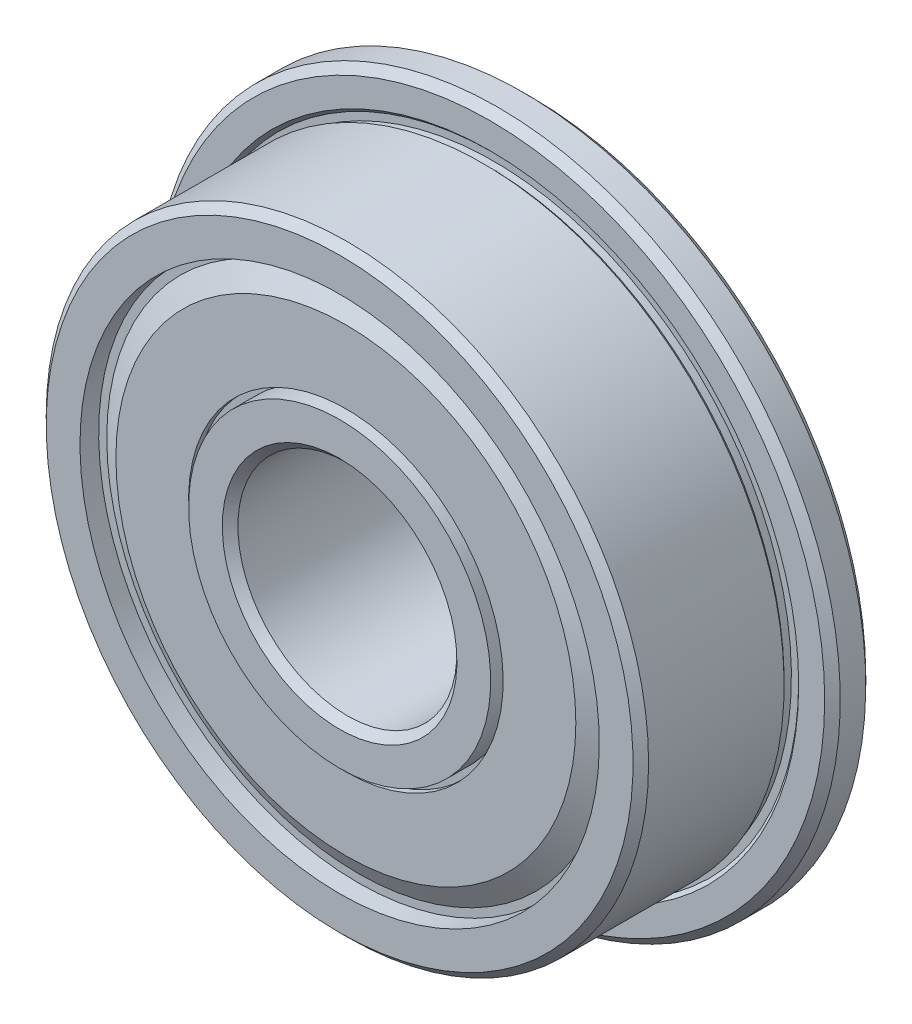
ISO-10303-21;
HEADER;
FILE_DESCRIPTION(('STEP AP214'),'2;1');
FILE_NAME('part.step','',(''),(''),'','','');
FILE_SCHEMA(('AUTOMOTIVE_DESIGN { 1 0 10303 214 1 1 1 1 }'));
ENDSEC;
DATA;
#1=APPLICATION_CONTEXT('core data for automotive mechanical design processes');
#2=APPLICATION_PROTOCOL_DEFINITION('international standard','automotive_design',2000,#1);
#3=PRODUCT_CONTEXT('',#1,'mechanical');
#4=PRODUCT('Part','Part','',(#3));
#5=PRODUCT_RELATED_PRODUCT_CATEGORY('part','',(#4));
#6=PRODUCT_DEFINITION_FORMATION('','',#4);
#7=PRODUCT_DEFINITION_CONTEXT('part definition',#1,'design');
#8=PRODUCT_DEFINITION('design','',#6,#7);
#9=PRODUCT_DEFINITION_SHAPE('','',#8);
#10=(LENGTH_UNIT() NAMED_UNIT(*) SI_UNIT(.MILLI.,.METRE.));
#11=(NAMED_UNIT(*) PLANE_ANGLE_UNIT() SI_UNIT($,.RADIAN.));
#12=(NAMED_UNIT(*) SI_UNIT($,.STERADIAN.) SOLID_ANGLE_UNIT());
#13=UNCERTAINTY_MEASURE_WITH_UNIT(LENGTH_MEASURE(1.E-05),#10,'distance_accuracy_value','');
#14=(GEOMETRIC_REPRESENTATION_CONTEXT(3) GLOBAL_UNCERTAINTY_ASSIGNED_CONTEXT((#13)) GLOBAL_UNIT_ASSIGNED_CONTEXT((#10,
#11,#12)) REPRESENTATION_CONTEXT('',''));
#15=CARTESIAN_POINT('',(0.,0.,0.));
#16=DIRECTION('',(0.,0.,1.));
#17=DIRECTION('',(1.,0.,0.));
#18=AXIS2_PLACEMENT_3D('',#15,#16,#17);
#19=CARTESIAN_POINT('',(0.,0.,0.));
#20=DIRECTION('',(0.,0.,1.));
#21=DIRECTION('',(0.,-1.,0.));
#22=AXIS2_PLACEMENT_3D('',#19,#20,#21);
#23=CYLINDRICAL_SURFACE('',#22,9.48333333333333);
#24=CARTESIAN_POINT('',(0.,0.,-2.59));
#25=DIRECTION('',(0.,0.,1.));
#26=DIRECTION('',(0.,-1.,0.));
#27=AXIS2_PLACEMENT_3D('',#24,#25,#26);
#28=CIRCLE('',#27,9.48333333333333);
#29=CARTESIAN_POINT('',(0.,-9.48333333333333,-2.59));
#30=VERTEX_POINT('',#29);
#31=EDGE_CURVE('E80',#30,#30,#28,.T.);
#32=ORIENTED_EDGE('',*,*,#31,.F.);
#33=EDGE_LOOP('',(#32));
#34=FACE_BOUND('',#33,.T.);
#35=CARTESIAN_POINT('',(0.,0.,-2.8175));
#36=DIRECTION('',(0.,0.,1.));
#37=DIRECTION('',(0.,-1.,0.));
#38=AXIS2_PLACEMENT_3D('',#35,#36,#37);
#39=CIRCLE('',#38,9.48333333333333);
#40=CARTESIAN_POINT('',(0.,-9.48333333333333,-2.8175));
#41=VERTEX_POINT('',#40);
#42=EDGE_CURVE('E12',#41,#41,#39,.T.);
#43=ORIENTED_EDGE('',*,*,#42,.T.);
#44=EDGE_LOOP('',(#43));
#45=FACE_BOUND('',#44,.T.);
#46=ADVANCED_FACE('F52',(#34,#45),#23,.T.);
#47=CARTESIAN_POINT('',(0.,9.48333333333333,-2.8175));
#48=DIRECTION('',(0.,0.,1.));
#49=DIRECTION('',(0.,-1.,0.));
#50=AXIS2_PLACEMENT_3D('',#47,#48,#49);
#51=PLANE('',#50);
#52=ORIENTED_EDGE('',*,*,#42,.F.);
#53=EDGE_LOOP('',(#52));
#54=FACE_BOUND('',#53,.T.);
#55=CARTESIAN_POINT('',(0.,0.,-2.8175));
#56=DIRECTION('',(0.,0.,1.));
#57=DIRECTION('',(0.,-1.,0.));
#58=AXIS2_PLACEMENT_3D('',#55,#56,#57);
#59=CIRCLE('',#58,9.18714891746856);
#60=CARTESIAN_POINT('',(0.,-9.18714891746856,-2.8175));
#61=VERTEX_POINT('',#60);
#62=EDGE_CURVE('E58',#61,#61,#59,.T.);
#63=ORIENTED_EDGE('',*,*,#62,.T.);
#64=EDGE_LOOP('',(#63));
#65=FACE_BOUND('',#64,.T.);
#66=ADVANCED_FACE('F87',(#54,#65),#51,.F.);
#67=CARTESIAN_POINT('',(0.,0.,-3.2725));
#68=DIRECTION('',(0.,0.,1.));
#69=DIRECTION('',(0.,-1.,0.));
#70=AXIS2_PLACEMENT_3D('',#67,#68,#69);
#71=CONICAL_SURFACE('',#70,8.39906580002472,1.0471975511966);
#72=ORIENTED_EDGE('',*,*,#62,.F.);
#73=EDGE_LOOP('',(#72));
#74=FACE_BOUND('',#73,.T.);
#75=CARTESIAN_POINT('',(0.,0.,-3.2725));
#76=DIRECTION('',(0.,0.,1.));
#77=DIRECTION('',(0.,-1.,0.));
#78=AXIS2_PLACEMENT_3D('',#75,#76,#77);
#79=CIRCLE('',#78,8.39906580002472);
#80=CARTESIAN_POINT('',(0.,-8.39906580002472,-3.2725));
#81=VERTEX_POINT('',#80);
#82=EDGE_CURVE('E62',#81,#81,#79,.T.);
#83=ORIENTED_EDGE('',*,*,#82,.T.);
#84=EDGE_LOOP('',(#83));
#85=FACE_BOUND('',#84,.T.);
#86=ADVANCED_FACE('F91',(#74,#85),#71,.T.);
#87=CARTESIAN_POINT('',(0.,8.39906580002472,-3.2725));
#88=DIRECTION('',(0.,0.,1.));
#89=DIRECTION('',(0.,-1.,0.));
#90=AXIS2_PLACEMENT_3D('',#87,#88,#89);
#91=PLANE('',#90);
#92=ORIENTED_EDGE('',*,*,#82,.F.);
#93=EDGE_LOOP('',(#92));
#94=FACE_BOUND('',#93,.T.);
#95=CARTESIAN_POINT('',(0.,0.,-3.2725));
#96=DIRECTION('',(0.,0.,1.));
#97=DIRECTION('',(0.,-1.,0.));
#98=AXIS2_PLACEMENT_3D('',#95,#96,#97);
#99=CIRCLE('',#98,5.74416666666667);
#100=CARTESIAN_POINT('',(0.,-5.74416666666667,-3.2725));
#101=VERTEX_POINT('',#100);
#102=EDGE_CURVE('E66',#101,#101,#99,.T.);
#103=ORIENTED_EDGE('',*,*,#102,.T.);
#104=EDGE_LOOP('',(#103));
#105=FACE_BOUND('',#104,.T.);
#106=ADVANCED_FACE('F96',(#94,#105),#91,.F.);
#107=CARTESIAN_POINT('',(0.,0.,0.));
#108=DIRECTION('',(0.,0.,1.));
#109=DIRECTION('',(0.,-1.,0.));
#110=AXIS2_PLACEMENT_3D('',#107,#108,#109);
#111=CYLINDRICAL_SURFACE('',#110,5.74416666666667);
#112=ORIENTED_EDGE('',*,*,#102,.F.);
#113=EDGE_LOOP('',(#112));
#114=FACE_BOUND('',#113,.T.);
#115=CARTESIAN_POINT('',(0.,0.,-3.045));
#116=DIRECTION('',(0.,0.,1.));
#117=DIRECTION('',(0.,-1.,0.));
#118=AXIS2_PLACEMENT_3D('',#115,#116,#117);
#119=CIRCLE('',#118,5.74416666666667);
#120=CARTESIAN_POINT('',(0.,-5.74416666666667,-3.045));
#121=VERTEX_POINT('',#120);
#122=EDGE_CURVE('E71',#121,#121,#119,.T.);
#123=ORIENTED_EDGE('',*,*,#122,.T.);
#124=EDGE_LOOP('',(#123));
#125=FACE_BOUND('',#124,.T.);
#126=ADVANCED_FACE('F102',(#114,#125),#111,.F.);
#127=CARTESIAN_POINT('',(0.,8.33810735874664,-3.045));
#128=DIRECTION('',(0.,0.,-1.));
#129=DIRECTION('',(0.,1.,0.));
#130=AXIS2_PLACEMENT_3D('',#127,#128,#129);
#131=PLANE('',#130);
#132=ORIENTED_EDGE('',*,*,#122,.F.);
#133=EDGE_LOOP('',(#132));
#134=FACE_BOUND('',#133,.T.);
#135=CARTESIAN_POINT('',(0.,0.,-3.045));
#136=DIRECTION('',(0.,0.,1.));
#137=DIRECTION('',(0.,-1.,0.));
#138=AXIS2_PLACEMENT_3D('',#135,#136,#137);
#139=CIRCLE('',#138,8.33810735874664);
#140=CARTESIAN_POINT('',(0.,-8.33810735874664,-3.045));
#141=VERTEX_POINT('',#140);
#142=EDGE_CURVE('E74',#141,#141,#139,.T.);
#143=ORIENTED_EDGE('',*,*,#142,.T.);
#144=EDGE_LOOP('',(#143));
#145=FACE_BOUND('',#144,.T.);
#146=ADVANCED_FACE('F106',(#134,#145),#131,.F.);
#147=CARTESIAN_POINT('',(0.,0.,-2.59));
#148=DIRECTION('',(0.,0.,1.));
#149=DIRECTION('',(0.,-1.,0.));
#150=AXIS2_PLACEMENT_3D('',#147,#148,#149);
#151=CONICAL_SURFACE('',#150,9.12619047619048,1.0471975511966);
#152=ORIENTED_EDGE('',*,*,#142,.F.);
#153=EDGE_LOOP('',(#152));
#154=FACE_BOUND('',#153,.T.);
#155=CARTESIAN_POINT('',(0.,0.,-2.59));
#156=DIRECTION('',(0.,0.,1.));
#157=DIRECTION('',(0.,-1.,0.));
#158=AXIS2_PLACEMENT_3D('',#155,#156,#157);
#159=CIRCLE('',#158,9.12619047619048);
#160=CARTESIAN_POINT('',(0.,-9.12619047619048,-2.59));
#161=VERTEX_POINT('',#160);
#162=EDGE_CURVE('E77',#161,#161,#159,.T.);
#163=ORIENTED_EDGE('',*,*,#162,.T.);
#164=EDGE_LOOP('',(#163));
#165=FACE_BOUND('',#164,.T.);
#166=ADVANCED_FACE('F110',(#154,#165),#151,.F.);
#167=CARTESIAN_POINT('',(0.,9.48333333333333,-2.59));
#168=DIRECTION('',(0.,0.,-1.));
#169=DIRECTION('',(0.,1.,0.));
#170=AXIS2_PLACEMENT_3D('',#167,#168,#169);
#171=PLANE('',#170);
#172=ORIENTED_EDGE('',*,*,#162,.F.);
#173=EDGE_LOOP('',(#172));
#174=FACE_BOUND('',#173,.T.);
#175=ORIENTED_EDGE('',*,*,#31,.T.);
#176=EDGE_LOOP('',(#175));
#177=FACE_BOUND('',#176,.T.);
#178=ADVANCED_FACE('F84',(#174,#177),#171,.F.);
#179=CLOSED_SHELL('',(#46,#66,#86,#106,#126,#146,#166,#178));
#180=MANIFOLD_SOLID_BREP('B2',#179);
#181=CARTESIAN_POINT('',(0.,0.,0.));
#182=DIRECTION('',(0.,0.,1.));
#183=DIRECTION('',(0.,-1.,0.));
#184=AXIS2_PLACEMENT_3D('',#181,#182,#183);
#185=CYLINDRICAL_SURFACE('',#184,9.48333333333333);
#186=CARTESIAN_POINT('',(0.,0.,2.8175));
#187=DIRECTION('',(0.,0.,1.));
#188=DIRECTION('',(0.,-1.,0.));
#189=AXIS2_PLACEMENT_3D('',#186,#187,#188);
#190=CIRCLE('',#189,9.48333333333333);
#191=CARTESIAN_POINT('',(0.,-9.48333333333333,2.8175));
#192=VERTEX_POINT('',#191);
#193=EDGE_CURVE('E51',#192,#192,#190,.T.);
#194=ORIENTED_EDGE('',*,*,#193,.F.);
#195=EDGE_LOOP('',(#194));
#196=FACE_BOUND('',#195,.T.);
#197=CARTESIAN_POINT('',(0.,0.,2.59));
#198=DIRECTION('',(0.,0.,1.));
#199=DIRECTION('',(0.,-1.,0.));
#200=AXIS2_PLACEMENT_3D('',#197,#198,#199);
#201=CIRCLE('',#200,9.48333333333333);
#202=CARTESIAN_POINT('',(0.,-9.48333333333333,2.59));
#203=VERTEX_POINT('',#202);
#204=EDGE_CURVE('E192',#203,#203,#201,.T.);
#205=ORIENTED_EDGE('',*,*,#204,.T.);
#206=EDGE_LOOP('',(#205));
#207=FACE_BOUND('',#206,.T.);
#208=ADVANCED_FACE('F164',(#196,#207),#185,.T.);
#209=CARTESIAN_POINT('',(0.,9.48333333333333,2.8175));
#210=DIRECTION('',(0.,0.,-1.));
#211=DIRECTION('',(0.,1.,0.));
#212=AXIS2_PLACEMENT_3D('',#209,#210,#211);
#213=PLANE('',#212);
#214=CARTESIAN_POINT('',(0.,0.,2.8175));
#215=DIRECTION('',(0.,0.,1.));
#216=DIRECTION('',(0.,-1.,0.));
#217=AXIS2_PLACEMENT_3D('',#214,#215,#216);
#218=CIRCLE('',#217,9.18714891746856);
#219=CARTESIAN_POINT('',(0.,-9.18714891746856,2.8175));
#220=VERTEX_POINT('',#219);
#221=EDGE_CURVE('E170',#220,#220,#218,.T.);
#222=ORIENTED_EDGE('',*,*,#221,.F.);
#223=EDGE_LOOP('',(#222));
#224=FACE_BOUND('',#223,.T.);
#225=ORIENTED_EDGE('',*,*,#193,.T.);
#226=EDGE_LOOP('',(#225));
#227=FACE_BOUND('',#226,.T.);
#228=ADVANCED_FACE('F229',(#224,#227),#213,.F.);
#229=CARTESIAN_POINT('',(0.,0.,2.8175));
#230=DIRECTION('',(0.,0.,-1.));
#231=DIRECTION('',(0.,1.,0.));
#232=AXIS2_PLACEMENT_3D('',#229,#230,#231);
#233=CONICAL_SURFACE('',#232,9.18714891746856,1.0471975511966);
#234=CARTESIAN_POINT('',(0.,0.,3.2725));
#235=DIRECTION('',(0.,0.,1.));
#236=DIRECTION('',(0.,-1.,0.));
#237=AXIS2_PLACEMENT_3D('',#234,#235,#236);
#238=CIRCLE('',#237,8.39906580002472);
#239=CARTESIAN_POINT('',(0.,-8.39906580002472,3.2725));
#240=VERTEX_POINT('',#239);
#241=EDGE_CURVE('E174',#240,#240,#238,.T.);
#242=ORIENTED_EDGE('',*,*,#241,.F.);
#243=EDGE_LOOP('',(#242));
#244=FACE_BOUND('',#243,.T.);
#245=ORIENTED_EDGE('',*,*,#221,.T.);
#246=EDGE_LOOP('',(#245));
#247=FACE_BOUND('',#246,.T.);
#248=ADVANCED_FACE('F224',(#244,#247),#233,.T.);
#249=CARTESIAN_POINT('',(0.,8.39906580002472,3.2725));
#250=DIRECTION('',(0.,0.,-1.));
#251=DIRECTION('',(0.,1.,0.));
#252=AXIS2_PLACEMENT_3D('',#249,#250,#251);
#253=PLANE('',#252);
#254=CARTESIAN_POINT('',(0.,0.,3.2725));
#255=DIRECTION('',(0.,0.,1.));
#256=DIRECTION('',(0.,-1.,0.));
#257=AXIS2_PLACEMENT_3D('',#254,#255,#256);
#258=CIRCLE('',#257,5.74416666666666);
#259=CARTESIAN_POINT('',(0.,-5.74416666666666,3.2725));
#260=VERTEX_POINT('',#259);
#261=EDGE_CURVE('E178',#260,#260,#258,.T.);
#262=ORIENTED_EDGE('',*,*,#261,.F.);
#263=EDGE_LOOP('',(#262));
#264=FACE_BOUND('',#263,.T.);
#265=ORIENTED_EDGE('',*,*,#241,.T.);
#266=EDGE_LOOP('',(#265));
#267=FACE_BOUND('',#266,.T.);
#268=ADVANCED_FACE('F218',(#264,#267),#253,.F.);
#269=CARTESIAN_POINT('',(0.,0.,0.));
#270=DIRECTION('',(0.,0.,1.));
#271=DIRECTION('',(0.,-1.,0.));
#272=AXIS2_PLACEMENT_3D('',#269,#270,#271);
#273=CYLINDRICAL_SURFACE('',#272,5.74416666666666);
#274=CARTESIAN_POINT('',(0.,0.,3.045));
#275=DIRECTION('',(0.,0.,1.));
#276=DIRECTION('',(0.,-1.,0.));
#277=AXIS2_PLACEMENT_3D('',#274,#275,#276);
#278=CIRCLE('',#277,5.74416666666666);
#279=CARTESIAN_POINT('',(0.,-5.74416666666666,3.045));
#280=VERTEX_POINT('',#279);
#281=EDGE_CURVE('E183',#280,#280,#278,.T.);
#282=ORIENTED_EDGE('',*,*,#281,.F.);
#283=EDGE_LOOP('',(#282));
#284=FACE_BOUND('',#283,.T.);
#285=ORIENTED_EDGE('',*,*,#261,.T.);
#286=EDGE_LOOP('',(#285));
#287=FACE_BOUND('',#286,.T.);
#288=ADVANCED_FACE('F212',(#284,#287),#273,.F.);
#289=CARTESIAN_POINT('',(0.,8.33810735874663,3.045));
#290=DIRECTION('',(0.,0.,1.));
#291=DIRECTION('',(0.,-1.,0.));
#292=AXIS2_PLACEMENT_3D('',#289,#290,#291);
#293=PLANE('',#292);
#294=CARTESIAN_POINT('',(0.,0.,3.045));
#295=DIRECTION('',(0.,0.,1.));
#296=DIRECTION('',(0.,-1.,0.));
#297=AXIS2_PLACEMENT_3D('',#294,#295,#296);
#298=CIRCLE('',#297,8.33810735874663);
#299=CARTESIAN_POINT('',(0.,-8.33810735874663,3.045));
#300=VERTEX_POINT('',#299);
#301=EDGE_CURVE('E186',#300,#300,#298,.T.);
#302=ORIENTED_EDGE('',*,*,#301,.F.);
#303=EDGE_LOOP('',(#302));
#304=FACE_BOUND('',#303,.T.);
#305=ORIENTED_EDGE('',*,*,#281,.T.);
#306=EDGE_LOOP('',(#305));
#307=FACE_BOUND('',#306,.T.);
#308=ADVANCED_FACE('F206',(#304,#307),#293,.F.);
#309=CARTESIAN_POINT('',(0.,0.,3.045));
#310=DIRECTION('',(0.,0.,-1.));
#311=DIRECTION('',(0.,1.,0.));
#312=AXIS2_PLACEMENT_3D('',#309,#310,#311);
#313=CONICAL_SURFACE('',#312,8.33810735874663,1.0471975511966);
#314=CARTESIAN_POINT('',(0.,0.,2.59));
#315=DIRECTION('',(0.,0.,1.));
#316=DIRECTION('',(0.,-1.,0.));
#317=AXIS2_PLACEMENT_3D('',#314,#315,#316);
#318=CIRCLE('',#317,9.12619047619048);
#319=CARTESIAN_POINT('',(0.,-9.12619047619048,2.59));
#320=VERTEX_POINT('',#319);
#321=EDGE_CURVE('E189',#320,#320,#318,.T.);
#322=ORIENTED_EDGE('',*,*,#321,.F.);
#323=EDGE_LOOP('',(#322));
#324=FACE_BOUND('',#323,.T.);
#325=ORIENTED_EDGE('',*,*,#301,.T.);
#326=EDGE_LOOP('',(#325));
#327=FACE_BOUND('',#326,.T.);
#328=ADVANCED_FACE('F200',(#324,#327),#313,.F.);
#329=CARTESIAN_POINT('',(0.,9.48333333333333,2.59));
#330=DIRECTION('',(0.,0.,1.));
#331=DIRECTION('',(0.,-1.,0.));
#332=AXIS2_PLACEMENT_3D('',#329,#330,#331);
#333=PLANE('',#332);
#334=ORIENTED_EDGE('',*,*,#204,.F.);
#335=EDGE_LOOP('',(#334));
#336=FACE_BOUND('',#335,.T.);
#337=ORIENTED_EDGE('',*,*,#321,.T.);
#338=EDGE_LOOP('',(#337));
#339=FACE_BOUND('',#338,.T.);
#340=ADVANCED_FACE('F197',(#336,#339),#333,.F.);
#341=CLOSED_SHELL('',(#208,#228,#248,#268,#288,#308,#328,#340));
#342=MANIFOLD_SOLID_BREP('B7',#341);
#343=CARTESIAN_POINT('',(-5.30330085889904,5.30330085889917,0.));
#344=DIRECTION('',(-0.707106781186539,0.707106781186556,0.));
#345=DIRECTION('',(0.707106781186556,0.707106781186539,0.));
#346=AXIS2_PLACEMENT_3D('',#343,#344,#345);
#347=SPHERICAL_SURFACE('',#346,1.9845);
#348=CARTESIAN_POINT('',(-6.70655426616373,6.70655426616389,0.));
#349=VERTEX_POINT('',#348);
#350=VERTEX_LOOP('',#349);
#351=FACE_BOUND('',#350,.T.);
#352=ADVANCED_FACE('F276',(#351),#347,.T.);
#353=CLOSED_SHELL('',(#352));
#354=MANIFOLD_SOLID_BREP('B46',#353);
#355=CARTESIAN_POINT('',(-7.5,0.,0.));
#356=DIRECTION('',(-1.,0.,0.));
#357=DIRECTION('',(0.,1.,0.));
#358=AXIS2_PLACEMENT_3D('',#355,#356,#357);
#359=SPHERICAL_SURFACE('',#358,1.9845);
#360=CARTESIAN_POINT('',(-9.4845,0.,0.));
#361=VERTEX_POINT('',#360);
#362=VERTEX_LOOP('',#361);
#363=FACE_BOUND('',#362,.T.);
#364=ADVANCED_FACE('F293',(#363),#359,.T.);
#365=CLOSED_SHELL('',(#364));
#366=MANIFOLD_SOLID_BREP('B160',#365);
#367=CARTESIAN_POINT('',(-5.30330085889915,-5.30330085889906,0.));
#368=DIRECTION('',(-0.707106781186554,-0.707106781186541,0.));
#369=DIRECTION('',(-0.707106781186541,0.707106781186554,0.));
#370=AXIS2_PLACEMENT_3D('',#367,#368,#369);
#371=SPHERICAL_SURFACE('',#370,1.9845);
#372=CARTESIAN_POINT('',(-6.70655426616387,-6.70655426616375,0.));
#373=VERTEX_POINT('',#372);
#374=VERTEX_LOOP('',#373);
#375=FACE_BOUND('',#374,.T.);
#376=ADVANCED_FACE('F310',(#375),#371,.T.);
#377=CLOSED_SHELL('',(#376));
#378=MANIFOLD_SOLID_BREP('B272',#377);
#379=CARTESIAN_POINT('',(0.,-7.5,0.));
#380=DIRECTION('',(0.,-1.,0.));
#381=DIRECTION('',(-1.,0.,0.));
#382=AXIS2_PLACEMENT_3D('',#379,#380,#381);
#383=SPHERICAL_SURFACE('',#382,1.9845);
#384=CARTESIAN_POINT('',(0.,-9.4845,0.));
#385=VERTEX_POINT('',#384);
#386=VERTEX_LOOP('',#385);
#387=FACE_BOUND('',#386,.T.);
#388=ADVANCED_FACE('F327',(#387),#383,.T.);
#389=CLOSED_SHELL('',(#388));
#390=MANIFOLD_SOLID_BREP('B289',#389);
#391=CARTESIAN_POINT('',(5.30330085889908,-5.30330085889913,0.));
#392=DIRECTION('',(0.707106781186544,-0.707106781186551,0.));
#393=DIRECTION('',(-0.707106781186551,-0.707106781186544,0.));
#394=AXIS2_PLACEMENT_3D('',#391,#392,#393);
#395=SPHERICAL_SURFACE('',#394,1.9845);
#396=CARTESIAN_POINT('',(6.70655426616378,-6.70655426616384,0.));
#397=VERTEX_POINT('',#396);
#398=VERTEX_LOOP('',#397);
#399=FACE_BOUND('',#398,.T.);
#400=ADVANCED_FACE('F344',(#399),#395,.T.);
#401=CLOSED_SHELL('',(#400));
#402=MANIFOLD_SOLID_BREP('B306',#401);
#403=CARTESIAN_POINT('',(7.5,0.,0.));
#404=DIRECTION('',(1.,0.,0.));
#405=DIRECTION('',(0.,-1.,0.));
#406=AXIS2_PLACEMENT_3D('',#403,#404,#405);
#407=SPHERICAL_SURFACE('',#406,1.9845);
#408=CARTESIAN_POINT('',(9.4845,0.,0.));
#409=VERTEX_POINT('',#408);
#410=VERTEX_LOOP('',#409);
#411=FACE_BOUND('',#410,.T.);
#412=ADVANCED_FACE('F361',(#411),#407,.T.);
#413=CLOSED_SHELL('',(#412));
#414=MANIFOLD_SOLID_BREP('B323',#413);
#415=CARTESIAN_POINT('',(5.30330085889912,5.3033008588991,0.));
#416=DIRECTION('',(0.707106781186549,0.707106781186546,0.));
#417=DIRECTION('',(0.707106781186546,-0.707106781186549,0.));
#418=AXIS2_PLACEMENT_3D('',#415,#416,#417);
#419=SPHERICAL_SURFACE('',#418,1.9845);
#420=CARTESIAN_POINT('',(6.70655426616382,6.7065542661638,0.));
#421=VERTEX_POINT('',#420);
#422=VERTEX_LOOP('',#421);
#423=FACE_BOUND('',#422,.T.);
#424=ADVANCED_FACE('F378',(#423),#419,.T.);
#425=CLOSED_SHELL('',(#424));
#426=MANIFOLD_SOLID_BREP('B340',#425);
#427=CARTESIAN_POINT('',(0.,7.5,0.));
#428=DIRECTION('',(0.,1.,0.));
#429=DIRECTION('',(1.,0.,0.));
#430=AXIS2_PLACEMENT_3D('',#427,#428,#429);
#431=SPHERICAL_SURFACE('',#430,1.9845);
#432=CARTESIAN_POINT('',(0.,9.4845,0.));
#433=VERTEX_POINT('',#432);
#434=VERTEX_LOOP('',#433);
#435=FACE_BOUND('',#434,.T.);
#436=ADVANCED_FACE('F398',(#435),#431,.T.);
#437=CLOSED_SHELL('',(#436));
#438=MANIFOLD_SOLID_BREP('B357',#437);
#439=CARTESIAN_POINT('',(0.,0.,0.));
#440=DIRECTION('',(0.,0.,1.));
#441=DIRECTION('',(0.,-1.,0.));
#442=AXIS2_PLACEMENT_3D('',#439,#440,#441);
#443=CYLINDRICAL_SURFACE('',#442,6.275);
#444=CARTESIAN_POINT('',(0.,0.,1.56128640870277));
#445=DIRECTION('',(0.,0.,1.));
#446=DIRECTION('',(0.,-1.,0.));
#447=AXIS2_PLACEMENT_3D('',#444,#445,#446);
#448=CIRCLE('',#447,6.275);
#449=CARTESIAN_POINT('',(0.,-6.275,1.56128640870277));
#450=VERTEX_POINT('',#449);
#451=EDGE_CURVE('E441',#450,#450,#448,.T.);
#452=ORIENTED_EDGE('',*,*,#451,.T.);
#453=EDGE_LOOP('',(#452));
#454=FACE_BOUND('',#453,.T.);
#455=CARTESIAN_POINT('',(0.,0.,2.59));
#456=DIRECTION('',(0.,0.,1.));
#457=DIRECTION('',(0.,-1.,0.));
#458=AXIS2_PLACEMENT_3D('',#455,#456,#457);
#459=CIRCLE('',#458,6.275);
#460=CARTESIAN_POINT('',(0.,-6.275,2.59));
#461=VERTEX_POINT('',#460);
#462=EDGE_CURVE('E459',#461,#461,#459,.T.);
#463=ORIENTED_EDGE('',*,*,#462,.F.);
#464=EDGE_LOOP('',(#463));
#465=FACE_BOUND('',#464,.T.);
#466=ADVANCED_FACE('F418',(#454,#465),#443,.T.);
#467=CARTESIAN_POINT('',(0.,4.,3.5));
#468=DIRECTION('',(0.,0.,-1.));
#469=DIRECTION('',(0.,1.,0.));
#470=AXIS2_PLACEMENT_3D('',#467,#468,#469);
#471=PLANE('',#470);
#472=CARTESIAN_POINT('',(0.,0.,3.5));
#473=DIRECTION('',(0.,0.,-1.));
#474=DIRECTION('',(0.,1.,0.));
#475=AXIS2_PLACEMENT_3D('',#472,#473,#474);
#476=CIRCLE('',#475,4.284375);
#477=CARTESIAN_POINT('',(0.,4.284375,3.5));
#478=VERTEX_POINT('',#477);
#479=EDGE_CURVE('E397',#478,#478,#476,.T.);
#480=ORIENTED_EDGE('',*,*,#479,.T.);
#481=EDGE_LOOP('',(#480));
#482=FACE_BOUND('',#481,.T.);
#483=CARTESIAN_POINT('',(0.,0.,3.5));
#484=DIRECTION('',(0.,0.,1.));
#485=DIRECTION('',(0.,-1.,0.));
#486=AXIS2_PLACEMENT_3D('',#483,#484,#485);
#487=CIRCLE('',#486,5.51666666666667);
#488=CARTESIAN_POINT('',(0.,-5.51666666666667,3.5));
#489=VERTEX_POINT('',#488);
#490=EDGE_CURVE('E453',#489,#489,#487,.T.);
#491=ORIENTED_EDGE('',*,*,#490,.T.);
#492=EDGE_LOOP('',(#491));
#493=FACE_BOUND('',#492,.T.);
#494=ADVANCED_FACE('F467',(#482,#493),#471,.F.);
#495=CARTESIAN_POINT('',(0.,0.,0.));
#496=DIRECTION('',(0.,0.,1.));
#497=DIRECTION('',(0.,-1.,0.));
#498=AXIS2_PLACEMENT_3D('',#495,#496,#497);
#499=CYLINDRICAL_SURFACE('',#498,6.275);
#500=CARTESIAN_POINT('',(0.,0.,-1.56128640870277));
#501=DIRECTION('',(0.,0.,1.));
#502=DIRECTION('',(0.,-1.,0.));
#503=AXIS2_PLACEMENT_3D('',#500,#501,#502);
#504=CIRCLE('',#503,6.275);
#505=CARTESIAN_POINT('',(0.,-6.275,-1.56128640870277));
#506=VERTEX_POINT('',#505);
#507=EDGE_CURVE('E438',#506,#506,#504,.T.);
#508=ORIENTED_EDGE('',*,*,#507,.F.);
#509=EDGE_LOOP('',(#508));
#510=FACE_BOUND('',#509,.T.);
#511=CARTESIAN_POINT('',(0.,0.,-2.59));
#512=DIRECTION('',(0.,0.,1.));
#513=DIRECTION('',(0.,-1.,0.));
#514=AXIS2_PLACEMENT_3D('',#511,#512,#513);
#515=CIRCLE('',#514,6.275);
#516=CARTESIAN_POINT('',(0.,-6.275,-2.59));
#517=VERTEX_POINT('',#516);
#518=EDGE_CURVE('E450',#517,#517,#515,.T.);
#519=ORIENTED_EDGE('',*,*,#518,.T.);
#520=EDGE_LOOP('',(#519));
#521=FACE_BOUND('',#520,.T.);
#522=ADVANCED_FACE('F474',(#510,#521),#499,.T.);
#523=CARTESIAN_POINT('',(0.,6.275,-3.5));
#524=DIRECTION('',(0.,0.,1.));
#525=DIRECTION('',(0.,-1.,0.));
#526=AXIS2_PLACEMENT_3D('',#523,#524,#525);
#527=PLANE('',#526);
#528=CARTESIAN_POINT('',(0.,0.,-3.5));
#529=DIRECTION('',(0.,0.,1.));
#530=DIRECTION('',(0.,-1.,0.));
#531=AXIS2_PLACEMENT_3D('',#528,#529,#530);
#532=CIRCLE('',#531,4.284375);
#533=CARTESIAN_POINT('',(0.,-4.284375,-3.5));
#534=VERTEX_POINT('',#533);
#535=EDGE_CURVE('E433',#534,#534,#532,.T.);
#536=ORIENTED_EDGE('',*,*,#535,.T.);
#537=EDGE_LOOP('',(#536));
#538=FACE_BOUND('',#537,.T.);
#539=CARTESIAN_POINT('',(0.,0.,-3.5));
#540=DIRECTION('',(0.,0.,1.));
#541=DIRECTION('',(0.,-1.,0.));
#542=AXIS2_PLACEMENT_3D('',#539,#540,#541);
#543=CIRCLE('',#542,5.51666666666667);
#544=CARTESIAN_POINT('',(0.,-5.51666666666667,-3.5));
#545=VERTEX_POINT('',#544);
#546=EDGE_CURVE('E444',#545,#545,#543,.T.);
#547=ORIENTED_EDGE('',*,*,#546,.F.);
#548=EDGE_LOOP('',(#547));
#549=FACE_BOUND('',#548,.T.);
#550=ADVANCED_FACE('F482',(#538,#549),#527,.F.);
#551=CARTESIAN_POINT('',(0.,0.,0.));
#552=DIRECTION('',(0.,0.,1.));
#553=DIRECTION('',(0.,-1.,0.));
#554=AXIS2_PLACEMENT_3D('',#551,#552,#553);
#555=TOROIDAL_SURFACE('',#554,7.5,1.9845);
#556=ORIENTED_EDGE('',*,*,#451,.F.);
#557=EDGE_LOOP('',(#556));
#558=FACE_BOUND('',#557,.T.);
#559=ORIENTED_EDGE('',*,*,#507,.T.);
#560=EDGE_LOOP('',(#559));
#561=FACE_BOUND('',#560,.T.);
#562=ADVANCED_FACE('F478',(#558,#561),#555,.F.);
#563=CARTESIAN_POINT('',(0.,0.,0.));
#564=DIRECTION('',(0.,0.,1.));
#565=DIRECTION('',(0.,-1.,0.));
#566=AXIS2_PLACEMENT_3D('',#563,#564,#565);
#567=CYLINDRICAL_SURFACE('',#566,4.);
#568=CARTESIAN_POINT('',(0.,0.,-3.215625));
#569=DIRECTION('',(0.,0.,1.));
#570=DIRECTION('',(0.,-1.,0.));
#571=AXIS2_PLACEMENT_3D('',#568,#569,#570);
#572=CIRCLE('',#571,4.);
#573=CARTESIAN_POINT('',(0.,-4.,-3.215625));
#574=VERTEX_POINT('',#573);
#575=EDGE_CURVE('E425',#574,#574,#572,.F.);
#576=ORIENTED_EDGE('',*,*,#575,.T.);
#577=EDGE_LOOP('',(#576));
#578=FACE_BOUND('',#577,.T.);
#579=CARTESIAN_POINT('',(0.,0.,3.215625));
#580=DIRECTION('',(0.,0.,-1.));
#581=DIRECTION('',(0.,1.,0.));
#582=AXIS2_PLACEMENT_3D('',#579,#580,#581);
#583=CIRCLE('',#582,4.);
#584=CARTESIAN_POINT('',(0.,4.,3.215625));
#585=VERTEX_POINT('',#584);
#586=EDGE_CURVE('E429',#585,#585,#583,.F.);
#587=ORIENTED_EDGE('',*,*,#586,.T.);
#588=EDGE_LOOP('',(#587));
#589=FACE_BOUND('',#588,.T.);
#590=ADVANCED_FACE('F481',(#578,#589),#567,.F.);
#591=CARTESIAN_POINT('',(0.,0.,-3.5));
#592=DIRECTION('',(0.,0.,-1.));
#593=DIRECTION('',(0.,1.,0.));
#594=AXIS2_PLACEMENT_3D('',#591,#592,#593);
#595=CONICAL_SURFACE('',#594,4.284375,0.785398163397448);
#596=ORIENTED_EDGE('',*,*,#575,.F.);
#597=EDGE_LOOP('',(#596));
#598=FACE_BOUND('',#597,.T.);
#599=ORIENTED_EDGE('',*,*,#535,.F.);
#600=EDGE_LOOP('',(#599));
#601=FACE_BOUND('',#600,.T.);
#602=ADVANCED_FACE('F486',(#598,#601),#595,.F.);
#603=CARTESIAN_POINT('',(0.,0.,3.215625));
#604=DIRECTION('',(0.,0.,1.));
#605=DIRECTION('',(0.,-1.,0.));
#606=AXIS2_PLACEMENT_3D('',#603,#604,#605);
#607=CONICAL_SURFACE('',#606,4.,0.785398163397448);
#608=ORIENTED_EDGE('',*,*,#479,.F.);
#609=EDGE_LOOP('',(#608));
#610=FACE_BOUND('',#609,.T.);
#611=ORIENTED_EDGE('',*,*,#586,.F.);
#612=EDGE_LOOP('',(#611));
#613=FACE_BOUND('',#612,.T.);
#614=ADVANCED_FACE('F420',(#610,#613),#607,.F.);
#615=CARTESIAN_POINT('',(0.,0.,0.));
#616=DIRECTION('',(0.,0.,1.));
#617=DIRECTION('',(0.,-1.,0.));
#618=AXIS2_PLACEMENT_3D('',#615,#616,#617);
#619=CYLINDRICAL_SURFACE('',#618,5.51666666666667);
#620=ORIENTED_EDGE('',*,*,#546,.T.);
#621=EDGE_LOOP('',(#620));
#622=FACE_BOUND('',#621,.T.);
#623=CARTESIAN_POINT('',(0.,0.,-2.59));
#624=DIRECTION('',(0.,0.,1.));
#625=DIRECTION('',(0.,-1.,0.));
#626=AXIS2_PLACEMENT_3D('',#623,#624,#625);
#627=CIRCLE('',#626,5.51666666666667);
#628=CARTESIAN_POINT('',(0.,-5.51666666666667,-2.59));
#629=VERTEX_POINT('',#628);
#630=EDGE_CURVE('E447',#629,#629,#627,.T.);
#631=ORIENTED_EDGE('',*,*,#630,.F.);
#632=EDGE_LOOP('',(#631));
#633=FACE_BOUND('',#632,.T.);
#634=ADVANCED_FACE('F492',(#622,#633),#619,.T.);
#635=CARTESIAN_POINT('',(0.,6.275,-2.59));
#636=DIRECTION('',(0.,0.,-1.));
#637=DIRECTION('',(0.,1.,0.));
#638=AXIS2_PLACEMENT_3D('',#635,#636,#637);
#639=PLANE('',#638);
#640=ORIENTED_EDGE('',*,*,#630,.T.);
#641=EDGE_LOOP('',(#640));
#642=FACE_BOUND('',#641,.T.);
#643=ORIENTED_EDGE('',*,*,#518,.F.);
#644=EDGE_LOOP('',(#643));
#645=FACE_BOUND('',#644,.T.);
#646=ADVANCED_FACE('F504',(#642,#645),#639,.T.);
#647=CARTESIAN_POINT('',(0.,0.,0.));
#648=DIRECTION('',(0.,0.,1.));
#649=DIRECTION('',(0.,-1.,0.));
#650=AXIS2_PLACEMENT_3D('',#647,#648,#649);
#651=CYLINDRICAL_SURFACE('',#650,5.51666666666667);
#652=CARTESIAN_POINT('',(0.,0.,2.59));
#653=DIRECTION('',(0.,0.,1.));
#654=DIRECTION('',(0.,-1.,0.));
#655=AXIS2_PLACEMENT_3D('',#652,#653,#654);
#656=CIRCLE('',#655,5.51666666666667);
#657=CARTESIAN_POINT('',(0.,-5.51666666666667,2.59));
#658=VERTEX_POINT('',#657);
#659=EDGE_CURVE('E456',#658,#658,#656,.T.);
#660=ORIENTED_EDGE('',*,*,#659,.T.);
#661=EDGE_LOOP('',(#660));
#662=FACE_BOUND('',#661,.T.);
#663=ORIENTED_EDGE('',*,*,#490,.F.);
#664=EDGE_LOOP('',(#663));
#665=FACE_BOUND('',#664,.T.);
#666=ADVANCED_FACE('F510',(#662,#665),#651,.T.);
#667=CARTESIAN_POINT('',(0.,6.275,2.59));
#668=DIRECTION('',(0.,0.,1.));
#669=DIRECTION('',(0.,-1.,0.));
#670=AXIS2_PLACEMENT_3D('',#667,#668,#669);
#671=PLANE('',#670);
#672=ORIENTED_EDGE('',*,*,#462,.T.);
#673=EDGE_LOOP('',(#672));
#674=FACE_BOUND('',#673,.T.);
#675=ORIENTED_EDGE('',*,*,#659,.F.);
#676=EDGE_LOOP('',(#675));
#677=FACE_BOUND('',#676,.T.);
#678=ADVANCED_FACE('F463',(#674,#677),#671,.T.);
#679=CLOSED_SHELL('',(#466,#494,#522,#550,#562,#590,#602,#614,#634,#646,#666,#678));
#680=MANIFOLD_SOLID_BREP('B374',#679);
#681=CARTESIAN_POINT('',(0.,8.725,-3.5));
#682=DIRECTION('',(0.,0.,1.));
#683=DIRECTION('',(0.,-1.,0.));
#684=AXIS2_PLACEMENT_3D('',#681,#682,#683);
#685=PLANE('',#684);
#686=CARTESIAN_POINT('',(0.,0.,-3.5));
#687=DIRECTION('',(0.,0.,1.));
#688=DIRECTION('',(0.,-1.,0.));
#689=AXIS2_PLACEMENT_3D('',#686,#687,#688);
#690=CIRCLE('',#689,12.215625);
#691=CARTESIAN_POINT('',(0.,-12.215625,-3.5));
#692=VERTEX_POINT('',#691);
#693=EDGE_CURVE('E592',#692,#692,#690,.F.);
#694=ORIENTED_EDGE('',*,*,#693,.T.);
#695=EDGE_LOOP('',(#694));
#696=FACE_BOUND('',#695,.T.);
#697=CARTESIAN_POINT('',(0.,0.,-3.5));
#698=DIRECTION('',(0.,0.,1.));
#699=DIRECTION('',(0.,-1.,0.));
#700=AXIS2_PLACEMENT_3D('',#697,#698,#699);
#701=CIRCLE('',#700,9.48333333333333);
#702=CARTESIAN_POINT('',(0.,-9.48333333333333,-3.5));
#703=VERTEX_POINT('',#702);
#704=EDGE_CURVE('E633',#703,#703,#701,.T.);
#705=ORIENTED_EDGE('',*,*,#704,.T.);
#706=EDGE_LOOP('',(#705));
#707=FACE_BOUND('',#706,.T.);
#708=ADVANCED_FACE('F577',(#696,#707),#685,.F.);
#709=CARTESIAN_POINT('',(0.,0.,0.));
#710=DIRECTION('',(0.,0.,1.));
#711=DIRECTION('',(0.,-1.,0.));
#712=AXIS2_PLACEMENT_3D('',#709,#710,#711);
#713=CYLINDRICAL_SURFACE('',#712,8.725);
#714=CARTESIAN_POINT('',(0.,0.,-1.56128640870277));
#715=DIRECTION('',(0.,0.,1.));
#716=DIRECTION('',(0.,-1.,0.));
#717=AXIS2_PLACEMENT_3D('',#714,#715,#716);
#718=CIRCLE('',#717,8.725);
#719=CARTESIAN_POINT('',(0.,-8.725,-1.56128640870277));
#720=VERTEX_POINT('',#719);
#721=EDGE_CURVE('E603',#720,#720,#718,.T.);
#722=ORIENTED_EDGE('',*,*,#721,.T.);
#723=EDGE_LOOP('',(#722));
#724=FACE_BOUND('',#723,.T.);
#725=CARTESIAN_POINT('',(0.,0.,-2.59));
#726=DIRECTION('',(0.,0.,1.));
#727=DIRECTION('',(0.,-1.,0.));
#728=AXIS2_PLACEMENT_3D('',#725,#726,#727);
#729=CIRCLE('',#728,8.725);
#730=CARTESIAN_POINT('',(0.,-8.725,-2.59));
#731=VERTEX_POINT('',#730);
#732=EDGE_CURVE('E639',#731,#731,#729,.T.);
#733=ORIENTED_EDGE('',*,*,#732,.F.);
#734=EDGE_LOOP('',(#733));
#735=FACE_BOUND('',#734,.T.);
#736=ADVANCED_FACE('F646',(#724,#735),#713,.F.);
#737=CARTESIAN_POINT('',(0.,0.,0.));
#738=DIRECTION('',(0.,0.,1.));
#739=DIRECTION('',(0.,-1.,0.));
#740=AXIS2_PLACEMENT_3D('',#737,#738,#739);
#741=CYLINDRICAL_SURFACE('',#740,8.725);
#742=CARTESIAN_POINT('',(0.,0.,1.56128640870277));
#743=DIRECTION('',(0.,0.,1.));
#744=DIRECTION('',(0.,-1.,0.));
#745=AXIS2_PLACEMENT_3D('',#742,#743,#744);
#746=CIRCLE('',#745,8.725);
#747=CARTESIAN_POINT('',(0.,-8.725,1.56128640870277));
#748=VERTEX_POINT('',#747);
#749=EDGE_CURVE('E606',#748,#748,#746,.T.);
#750=ORIENTED_EDGE('',*,*,#749,.F.);
#751=EDGE_LOOP('',(#750));
#752=FACE_BOUND('',#751,.T.);
#753=CARTESIAN_POINT('',(0.,0.,2.59));
#754=DIRECTION('',(0.,0.,1.));
#755=DIRECTION('',(0.,-1.,0.));
#756=AXIS2_PLACEMENT_3D('',#753,#754,#755);
#757=CIRCLE('',#756,8.725);
#758=CARTESIAN_POINT('',(0.,-8.725,2.59));
#759=VERTEX_POINT('',#758);
#760=EDGE_CURVE('E630',#759,#759,#757,.T.);
#761=ORIENTED_EDGE('',*,*,#760,.T.);
#762=EDGE_LOOP('',(#761));
#763=FACE_BOUND('',#762,.T.);
#764=ADVANCED_FACE('F648',(#752,#763),#741,.F.);
#765=CARTESIAN_POINT('',(0.,11.,3.5));
#766=DIRECTION('',(0.,0.,-1.));
#767=DIRECTION('',(0.,1.,0.));
#768=AXIS2_PLACEMENT_3D('',#765,#766,#767);
#769=PLANE('',#768);
#770=CARTESIAN_POINT('',(0.,0.,3.5));
#771=DIRECTION('',(0.,0.,-1.));
#772=DIRECTION('',(0.,1.,0.));
#773=AXIS2_PLACEMENT_3D('',#770,#771,#772);
#774=CIRCLE('',#773,10.715625);
#775=CARTESIAN_POINT('',(0.,10.715625,3.5));
#776=VERTEX_POINT('',#775);
#777=EDGE_CURVE('E584',#776,#776,#774,.F.);
#778=ORIENTED_EDGE('',*,*,#777,.T.);
#779=EDGE_LOOP('',(#778));
#780=FACE_BOUND('',#779,.T.);
#781=CARTESIAN_POINT('',(0.,0.,3.5));
#782=DIRECTION('',(0.,0.,1.));
#783=DIRECTION('',(0.,-1.,0.));
#784=AXIS2_PLACEMENT_3D('',#781,#782,#783);
#785=CIRCLE('',#784,9.48333333333333);
#786=CARTESIAN_POINT('',(0.,-9.48333333333333,3.5));
#787=VERTEX_POINT('',#786);
#788=EDGE_CURVE('E624',#787,#787,#785,.T.);
#789=ORIENTED_EDGE('',*,*,#788,.F.);
#790=EDGE_LOOP('',(#789));
#791=FACE_BOUND('',#790,.T.);
#792=ADVANCED_FACE('F655',(#780,#791),#769,.F.);
#793=CARTESIAN_POINT('',(0.,0.,0.));
#794=DIRECTION('',(0.,0.,1.));
#795=DIRECTION('',(0.,-1.,0.));
#796=AXIS2_PLACEMENT_3D('',#793,#794,#795);
#797=TOROIDAL_SURFACE('',#796,7.5,1.9845);
#798=ORIENTED_EDGE('',*,*,#721,.F.);
#799=EDGE_LOOP('',(#798));
#800=FACE_BOUND('',#799,.T.);
#801=ORIENTED_EDGE('',*,*,#749,.T.);
#802=EDGE_LOOP('',(#801));
#803=FACE_BOUND('',#802,.T.);
#804=ADVANCED_FACE('F661',(#800,#803),#797,.F.);
#805=CARTESIAN_POINT('',(0.,0.,0.));
#806=DIRECTION('',(0.,0.,1.));
#807=DIRECTION('',(0.,-1.,0.));
#808=AXIS2_PLACEMENT_3D('',#805,#806,#807);
#809=CYLINDRICAL_SURFACE('',#808,11.);
#810=CARTESIAN_POINT('',(0.,0.,3.215625));
#811=DIRECTION('',(0.,0.,-1.));
#812=DIRECTION('',(0.,1.,0.));
#813=AXIS2_PLACEMENT_3D('',#810,#811,#812);
#814=CIRCLE('',#813,11.);
#815=CARTESIAN_POINT('',(0.,11.,3.215625));
#816=VERTEX_POINT('',#815);
#817=EDGE_CURVE('E417',#816,#816,#814,.T.);
#818=ORIENTED_EDGE('',*,*,#817,.T.);
#819=EDGE_LOOP('',(#818));
#820=FACE_BOUND('',#819,.T.);
#821=CARTESIAN_POINT('',(0.,0.,-1.73483495705505));
#822=DIRECTION('',(0.,0.,1.));
#823=DIRECTION('',(0.,-1.,0.));
#824=AXIS2_PLACEMENT_3D('',#821,#822,#823);
#825=CIRCLE('',#824,11.);
#826=CARTESIAN_POINT('',(0.,-11.,-1.73483495705505));
#827=VERTEX_POINT('',#826);
#828=EDGE_CURVE('E609',#827,#827,#825,.T.);
#829=ORIENTED_EDGE('',*,*,#828,.T.);
#830=EDGE_LOOP('',(#829));
#831=FACE_BOUND('',#830,.T.);
#832=ADVANCED_FACE('F706',(#820,#831),#809,.T.);
#833=CARTESIAN_POINT('',(0.,0.,-1.86741747852753));
#834=DIRECTION('',(0.,0.,1.));
#835=DIRECTION('',(0.,-1.,0.));
#836=AXIS2_PLACEMENT_3D('',#833,#834,#835);
#837=CONICAL_SURFACE('',#836,10.8674174785275,0.785398163397447);
#838=ORIENTED_EDGE('',*,*,#828,.F.);
#839=EDGE_LOOP('',(#838));
#840=FACE_BOUND('',#839,.T.);
#841=CARTESIAN_POINT('',(0.,0.,-1.86741747852753));
#842=DIRECTION('',(0.,0.,1.));
#843=DIRECTION('',(0.,-1.,0.));
#844=AXIS2_PLACEMENT_3D('',#841,#842,#843);
#845=CIRCLE('',#844,10.8674174785275);
#846=CARTESIAN_POINT('',(0.,-10.8674174785275,-1.86741747852753));
#847=VERTEX_POINT('',#846);
#848=EDGE_CURVE('E612',#847,#847,#845,.T.);
#849=ORIENTED_EDGE('',*,*,#848,.T.);
#850=EDGE_LOOP('',(#849));
#851=FACE_BOUND('',#850,.T.);
#852=ADVANCED_FACE('F702',(#840,#851),#837,.T.);
#853=CARTESIAN_POINT('',(0.,0.,0.));
#854=DIRECTION('',(0.,0.,1.));
#855=DIRECTION('',(0.,-1.,0.));
#856=AXIS2_PLACEMENT_3D('',#853,#854,#855);
#857=CYLINDRICAL_SURFACE('',#856,10.8674174785275);
#858=ORIENTED_EDGE('',*,*,#848,.F.);
#859=EDGE_LOOP('',(#858));
#860=FACE_BOUND('',#859,.T.);
#861=CARTESIAN_POINT('',(0.,0.,-2.13258252147248));
#862=DIRECTION('',(0.,0.,1.));
#863=DIRECTION('',(0.,-1.,0.));
#864=AXIS2_PLACEMENT_3D('',#861,#862,#863);
#865=CIRCLE('',#864,10.8674174785275);
#866=CARTESIAN_POINT('',(0.,-10.8674174785275,-2.13258252147248));
#867=VERTEX_POINT('',#866);
#868=EDGE_CURVE('E615',#867,#867,#865,.T.);
#869=ORIENTED_EDGE('',*,*,#868,.T.);
#870=EDGE_LOOP('',(#869));
#871=FACE_BOUND('',#870,.T.);
#872=ADVANCED_FACE('F694',(#860,#871),#857,.T.);
#873=CARTESIAN_POINT('',(0.,11.1325825214725,-2.13258252147248));
#874=DIRECTION('',(0.,0.,-1.));
#875=DIRECTION('',(0.,1.,0.));
#876=AXIS2_PLACEMENT_3D('',#873,#874,#875);
#877=PLANE('',#876);
#878=ORIENTED_EDGE('',*,*,#868,.F.);
#879=EDGE_LOOP('',(#878));
#880=FACE_BOUND('',#879,.T.);
#881=CARTESIAN_POINT('',(0.,0.,-2.13258252147248));
#882=DIRECTION('',(0.,0.,1.));
#883=DIRECTION('',(0.,-1.,0.));
#884=AXIS2_PLACEMENT_3D('',#881,#882,#883);
#885=CIRCLE('',#884,11.1325825214725);
#886=CARTESIAN_POINT('',(0.,-11.1325825214725,-2.13258252147248));
#887=VERTEX_POINT('',#886);
#888=EDGE_CURVE('E618',#887,#887,#885,.T.);
#889=ORIENTED_EDGE('',*,*,#888,.T.);
#890=EDGE_LOOP('',(#889));
#891=FACE_BOUND('',#890,.T.);
#892=ADVANCED_FACE('F687',(#880,#891),#877,.F.);
#893=CARTESIAN_POINT('',(0.,0.,-2.));
#894=DIRECTION('',(0.,0.,1.));
#895=DIRECTION('',(0.,-1.,0.));
#896=AXIS2_PLACEMENT_3D('',#893,#894,#895);
#897=CONICAL_SURFACE('',#896,11.265165042945,0.785398163397448);
#898=ORIENTED_EDGE('',*,*,#888,.F.);
#899=EDGE_LOOP('',(#898));
#900=FACE_BOUND('',#899,.T.);
#901=CARTESIAN_POINT('',(0.,0.,-2.));
#902=DIRECTION('',(0.,0.,1.));
#903=DIRECTION('',(0.,-1.,0.));
#904=AXIS2_PLACEMENT_3D('',#901,#902,#903);
#905=CIRCLE('',#904,11.265165042945);
#906=CARTESIAN_POINT('',(0.,-11.265165042945,-2.));
#907=VERTEX_POINT('',#906);
#908=EDGE_CURVE('E621',#907,#907,#905,.T.);
#909=ORIENTED_EDGE('',*,*,#908,.T.);
#910=EDGE_LOOP('',(#909));
#911=FACE_BOUND('',#910,.T.);
#912=ADVANCED_FACE('F682',(#900,#911),#897,.F.);
#913=CARTESIAN_POINT('',(0.,12.5,-2.));
#914=DIRECTION('',(0.,0.,-1.));
#915=DIRECTION('',(0.,1.,0.));
#916=AXIS2_PLACEMENT_3D('',#913,#914,#915);
#917=PLANE('',#916);
#918=CARTESIAN_POINT('',(0.,0.,-2.));
#919=DIRECTION('',(0.,0.,-1.));
#920=DIRECTION('',(0.,1.,0.));
#921=AXIS2_PLACEMENT_3D('',#918,#919,#920);
#922=CIRCLE('',#921,12.215625);
#923=CARTESIAN_POINT('',(0.,12.215625,-2.));
#924=VERTEX_POINT('',#923);
#925=EDGE_CURVE('E588',#924,#924,#922,.F.);
#926=ORIENTED_EDGE('',*,*,#925,.T.);
#927=EDGE_LOOP('',(#926));
#928=FACE_BOUND('',#927,.T.);
#929=ORIENTED_EDGE('',*,*,#908,.F.);
#930=EDGE_LOOP('',(#929));
#931=FACE_BOUND('',#930,.T.);
#932=ADVANCED_FACE('F679',(#928,#931),#917,.F.);
#933=CARTESIAN_POINT('',(0.,0.,0.));
#934=DIRECTION('',(0.,0.,1.));
#935=DIRECTION('',(0.,-1.,0.));
#936=AXIS2_PLACEMENT_3D('',#933,#934,#935);
#937=CYLINDRICAL_SURFACE('',#936,12.5);
#938=CARTESIAN_POINT('',(0.,0.,-3.215625));
#939=DIRECTION('',(0.,0.,1.));
#940=DIRECTION('',(0.,-1.,0.));
#941=AXIS2_PLACEMENT_3D('',#938,#939,#940);
#942=CIRCLE('',#941,12.5);
#943=CARTESIAN_POINT('',(0.,-12.5,-3.215625));
#944=VERTEX_POINT('',#943);
#945=EDGE_CURVE('E597',#944,#944,#942,.T.);
#946=ORIENTED_EDGE('',*,*,#945,.T.);
#947=EDGE_LOOP('',(#946));
#948=FACE_BOUND('',#947,.T.);
#949=CARTESIAN_POINT('',(0.,0.,-2.284375));
#950=DIRECTION('',(0.,0.,-1.));
#951=DIRECTION('',(0.,1.,0.));
#952=AXIS2_PLACEMENT_3D('',#949,#950,#951);
#953=CIRCLE('',#952,12.5);
#954=CARTESIAN_POINT('',(0.,12.5,-2.284375));
#955=VERTEX_POINT('',#954);
#956=EDGE_CURVE('E600',#955,#955,#953,.T.);
#957=ORIENTED_EDGE('',*,*,#956,.T.);
#958=EDGE_LOOP('',(#957));
#959=FACE_BOUND('',#958,.T.);
#960=ADVANCED_FACE('F666',(#948,#959),#937,.T.);
#961=CARTESIAN_POINT('',(0.,0.,-3.215625));
#962=DIRECTION('',(0.,0.,1.));
#963=DIRECTION('',(0.,-1.,0.));
#964=AXIS2_PLACEMENT_3D('',#961,#962,#963);
#965=CONICAL_SURFACE('',#964,12.5,0.785398163397448);
#966=ORIENTED_EDGE('',*,*,#693,.F.);
#967=EDGE_LOOP('',(#966));
#968=FACE_BOUND('',#967,.T.);
#969=ORIENTED_EDGE('',*,*,#945,.F.);
#970=EDGE_LOOP('',(#969));
#971=FACE_BOUND('',#970,.T.);
#972=ADVANCED_FACE('F663',(#968,#971),#965,.T.);
#973=CARTESIAN_POINT('',(0.,0.,-2.));
#974=DIRECTION('',(0.,0.,-1.));
#975=DIRECTION('',(0.,1.,0.));
#976=AXIS2_PLACEMENT_3D('',#973,#974,#975);
#977=CONICAL_SURFACE('',#976,12.215625,0.785398163397448);
#978=ORIENTED_EDGE('',*,*,#956,.F.);
#979=EDGE_LOOP('',(#978));
#980=FACE_BOUND('',#979,.T.);
#981=ORIENTED_EDGE('',*,*,#925,.F.);
#982=EDGE_LOOP('',(#981));
#983=FACE_BOUND('',#982,.T.);
#984=ADVANCED_FACE('F665',(#980,#983),#977,.T.);
#985=CARTESIAN_POINT('',(0.,0.,3.5));
#986=DIRECTION('',(0.,0.,-1.));
#987=DIRECTION('',(0.,1.,0.));
#988=AXIS2_PLACEMENT_3D('',#985,#986,#987);
#989=CONICAL_SURFACE('',#988,10.715625,0.785398163397448);
#990=ORIENTED_EDGE('',*,*,#817,.F.);
#991=EDGE_LOOP('',(#990));
#992=FACE_BOUND('',#991,.T.);
#993=ORIENTED_EDGE('',*,*,#777,.F.);
#994=EDGE_LOOP('',(#993));
#995=FACE_BOUND('',#994,.T.);
#996=ADVANCED_FACE('F579',(#992,#995),#989,.T.);
#997=CARTESIAN_POINT('',(0.,0.,0.));
#998=DIRECTION('',(0.,0.,1.));
#999=DIRECTION('',(0.,-1.,0.));
#1000=AXIS2_PLACEMENT_3D('',#997,#998,#999);
#1001=CYLINDRICAL_SURFACE('',#1000,9.48333333333333);
#1002=ORIENTED_EDGE('',*,*,#788,.T.);
#1003=EDGE_LOOP('',(#1002));
#1004=FACE_BOUND('',#1003,.T.);
#1005=CARTESIAN_POINT('',(0.,0.,2.59));
#1006=DIRECTION('',(0.,0.,1.));
#1007=DIRECTION('',(0.,-1.,0.));
#1008=AXIS2_PLACEMENT_3D('',#1005,#1006,#1007);
#1009=CIRCLE('',#1008,9.48333333333333);
#1010=CARTESIAN_POINT('',(0.,-9.48333333333333,2.59));
#1011=VERTEX_POINT('',#1010);
#1012=EDGE_CURVE('E627',#1011,#1011,#1009,.T.);
#1013=ORIENTED_EDGE('',*,*,#1012,.F.);
#1014=EDGE_LOOP('',(#1013));
#1015=FACE_BOUND('',#1014,.T.);
#1016=ADVANCED_FACE('F673',(#1004,#1015),#1001,.F.);
#1017=CARTESIAN_POINT('',(0.,8.725,2.59));
#1018=DIRECTION('',(0.,0.,1.));
#1019=DIRECTION('',(0.,-1.,0.));
#1020=AXIS2_PLACEMENT_3D('',#1017,#1018,#1019);
#1021=PLANE('',#1020);
#1022=ORIENTED_EDGE('',*,*,#1012,.T.);
#1023=EDGE_LOOP('',(#1022));
#1024=FACE_BOUND('',#1023,.T.);
#1025=ORIENTED_EDGE('',*,*,#760,.F.);
#1026=EDGE_LOOP('',(#1025));
#1027=FACE_BOUND('',#1026,.T.);
#1028=ADVANCED_FACE('F719',(#1024,#1027),#1021,.T.);
#1029=CARTESIAN_POINT('',(0.,0.,0.));
#1030=DIRECTION('',(0.,0.,1.));
#1031=DIRECTION('',(0.,-1.,0.));
#1032=AXIS2_PLACEMENT_3D('',#1029,#1030,#1031);
#1033=CYLINDRICAL_SURFACE('',#1032,9.48333333333333);
#1034=CARTESIAN_POINT('',(0.,0.,-2.59));
#1035=DIRECTION('',(0.,0.,1.));
#1036=DIRECTION('',(0.,-1.,0.));
#1037=AXIS2_PLACEMENT_3D('',#1034,#1035,#1036);
#1038=CIRCLE('',#1037,9.48333333333333);
#1039=CARTESIAN_POINT('',(0.,-9.48333333333333,-2.59));
#1040=VERTEX_POINT('',#1039);
#1041=EDGE_CURVE('E636',#1040,#1040,#1038,.T.);
#1042=ORIENTED_EDGE('',*,*,#1041,.T.);
#1043=EDGE_LOOP('',(#1042));
#1044=FACE_BOUND('',#1043,.T.);
#1045=ORIENTED_EDGE('',*,*,#704,.F.);
#1046=EDGE_LOOP('',(#1045));
#1047=FACE_BOUND('',#1046,.T.);
#1048=ADVANCED_FACE('F725',(#1044,#1047),#1033,.F.);
#1049=CARTESIAN_POINT('',(0.,8.725,-2.59));
#1050=DIRECTION('',(0.,0.,-1.));
#1051=DIRECTION('',(0.,1.,0.));
#1052=AXIS2_PLACEMENT_3D('',#1049,#1050,#1051);
#1053=PLANE('',#1052);
#1054=ORIENTED_EDGE('',*,*,#732,.T.);
#1055=EDGE_LOOP('',(#1054));
#1056=FACE_BOUND('',#1055,.T.);
#1057=ORIENTED_EDGE('',*,*,#1041,.F.);
#1058=EDGE_LOOP('',(#1057));
#1059=FACE_BOUND('',#1058,.T.);
#1060=ADVANCED_FACE('F643',(#1056,#1059),#1053,.T.);
#1061=CLOSED_SHELL('',(#708,#736,#764,#792,#804,#832,#852,#872,#892,#912,#932,#960,#972,#984,
#996,#1016,#1028,#1048,#1060));
#1062=MANIFOLD_SOLID_BREP('B392',#1061);
#1063=ADVANCED_BREP_SHAPE_REPRESENTATION('',(#18,#180,#342,#354,#366,#378,#390,#402,#414,#426,
#438,#680,#1062),#14);
#1064=SHAPE_DEFINITION_REPRESENTATION(#9,#1063);
ENDSEC;
END-ISO-10303-21;
